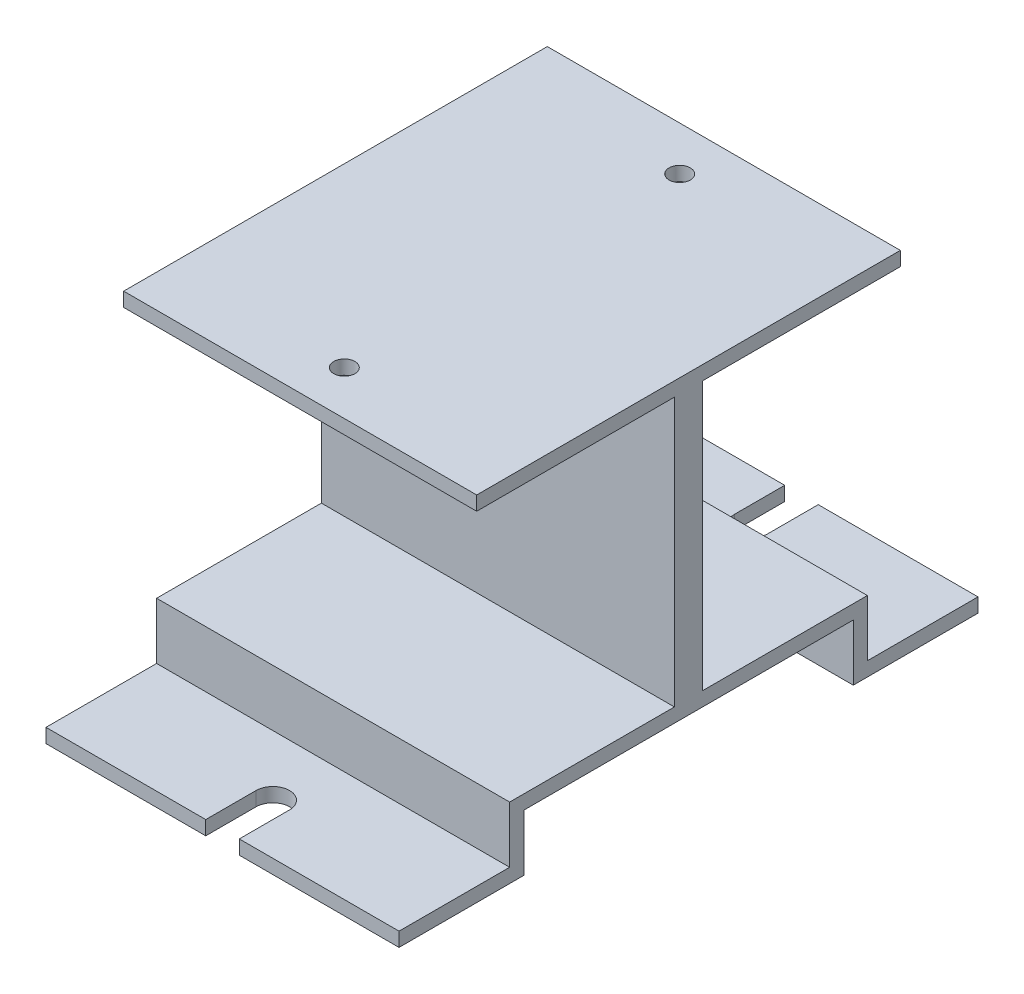
ISO-10303-21;
HEADER;
FILE_DESCRIPTION(('STEP AP214'),'2;1');
FILE_NAME('part.step','',(''),(''),'','','');
FILE_SCHEMA(('AUTOMOTIVE_DESIGN { 1 0 10303 214 1 1 1 1 }'));
ENDSEC;
DATA;
#1=APPLICATION_CONTEXT('core data for automotive mechanical design processes');
#2=APPLICATION_PROTOCOL_DEFINITION('international standard','automotive_design',2000,#1);
#3=PRODUCT_CONTEXT('',#1,'mechanical');
#4=PRODUCT('Part','Part','',(#3));
#5=PRODUCT_RELATED_PRODUCT_CATEGORY('part','',(#4));
#6=PRODUCT_DEFINITION_FORMATION('','',#4);
#7=PRODUCT_DEFINITION_CONTEXT('part definition',#1,'design');
#8=PRODUCT_DEFINITION('design','',#6,#7);
#9=PRODUCT_DEFINITION_SHAPE('','',#8);
#10=(LENGTH_UNIT() NAMED_UNIT(*) SI_UNIT(.MILLI.,.METRE.));
#11=(NAMED_UNIT(*) PLANE_ANGLE_UNIT() SI_UNIT($,.RADIAN.));
#12=(NAMED_UNIT(*) SI_UNIT($,.STERADIAN.) SOLID_ANGLE_UNIT());
#13=UNCERTAINTY_MEASURE_WITH_UNIT(LENGTH_MEASURE(1.E-05),#10,'distance_accuracy_value','');
#14=(GEOMETRIC_REPRESENTATION_CONTEXT(3) GLOBAL_UNCERTAINTY_ASSIGNED_CONTEXT((#13)) GLOBAL_UNIT_ASSIGNED_CONTEXT((#10,
#11,#12)) REPRESENTATION_CONTEXT('',''));
#15=CARTESIAN_POINT('',(0.,0.,0.));
#16=DIRECTION('',(0.,0.,1.));
#17=DIRECTION('',(1.,0.,0.));
#18=AXIS2_PLACEMENT_3D('',#15,#16,#17);
#19=CARTESIAN_POINT('',(25.,-6.,-41.));
#20=DIRECTION('',(0.,0.,-1.));
#21=DIRECTION('',(-1.,0.,0.));
#22=AXIS2_PLACEMENT_3D('',#19,#20,#21);
#23=PLANE('',#22);
#24=DIRECTION('',(0.,1.,0.));
#25=VECTOR('',#24,1.);
#26=CARTESIAN_POINT('',(-2.375,-6.,-41.));
#27=LINE('',#26,#25);
#28=CARTESIAN_POINT('',(-2.375,-8.,-41.));
#29=VERTEX_POINT('',#28);
#30=CARTESIAN_POINT('',(-2.375,-6.,-41.));
#31=VERTEX_POINT('',#30);
#32=EDGE_CURVE('E230',#29,#31,#27,.T.);
#33=ORIENTED_EDGE('',*,*,#32,.F.);
#34=DIRECTION('',(-1.,0.,0.));
#35=VECTOR('',#34,1.);
#36=CARTESIAN_POINT('',(25.,-8.,-41.));
#37=LINE('',#36,#35);
#38=CARTESIAN_POINT('',(-25.,-8.,-41.));
#39=VERTEX_POINT('',#38);
#40=EDGE_CURVE('E430',#29,#39,#37,.T.);
#41=ORIENTED_EDGE('',*,*,#40,.T.);
#42=DIRECTION('',(0.,-1.,0.));
#43=VECTOR('',#42,1.);
#44=CARTESIAN_POINT('',(-25.,-6.,-41.));
#45=LINE('',#44,#43);
#46=CARTESIAN_POINT('',(-25.,-6.,-41.));
#47=VERTEX_POINT('',#46);
#48=EDGE_CURVE('E403',#47,#39,#45,.T.);
#49=ORIENTED_EDGE('',*,*,#48,.F.);
#50=DIRECTION('',(-1.,0.,0.));
#51=VECTOR('',#50,1.);
#52=CARTESIAN_POINT('',(25.,-6.,-41.));
#53=LINE('',#52,#51);
#54=EDGE_CURVE('E427',#31,#47,#53,.T.);
#55=ORIENTED_EDGE('',*,*,#54,.F.);
#56=EDGE_LOOP('',(#33,#41,#49,#55));
#57=FACE_BOUND('',#56,.T.);
#58=ADVANCED_FACE('F32',(#57),#23,.T.);
#59=CARTESIAN_POINT('',(25.,-6.,41.));
#60=DIRECTION('',(0.,0.,1.));
#61=DIRECTION('',(-1.,0.,0.));
#62=AXIS2_PLACEMENT_3D('',#59,#60,#61);
#63=PLANE('',#62);
#64=DIRECTION('',(0.,1.,0.));
#65=VECTOR('',#64,1.);
#66=CARTESIAN_POINT('',(2.375,-6.,41.));
#67=LINE('',#66,#65);
#68=CARTESIAN_POINT('',(2.375,-8.,41.));
#69=VERTEX_POINT('',#68);
#70=CARTESIAN_POINT('',(2.375,-6.,41.));
#71=VERTEX_POINT('',#70);
#72=EDGE_CURVE('E255',#69,#71,#67,.T.);
#73=ORIENTED_EDGE('',*,*,#72,.F.);
#74=DIRECTION('',(-1.,0.,0.));
#75=VECTOR('',#74,1.);
#76=CARTESIAN_POINT('',(25.,-8.,41.));
#77=LINE('',#76,#75);
#78=CARTESIAN_POINT('',(25.,-8.,41.));
#79=VERTEX_POINT('',#78);
#80=EDGE_CURVE('E347',#79,#69,#77,.T.);
#81=ORIENTED_EDGE('',*,*,#80,.F.);
#82=DIRECTION('',(0.,-1.,0.));
#83=VECTOR('',#82,1.);
#84=CARTESIAN_POINT('',(25.,-6.,41.));
#85=LINE('',#84,#83);
#86=CARTESIAN_POINT('',(25.,-6.,41.));
#87=VERTEX_POINT('',#86);
#88=EDGE_CURVE('E304',#87,#79,#85,.T.);
#89=ORIENTED_EDGE('',*,*,#88,.F.);
#90=DIRECTION('',(-1.,0.,0.));
#91=VECTOR('',#90,1.);
#92=CARTESIAN_POINT('',(25.,-6.,41.));
#93=LINE('',#92,#91);
#94=EDGE_CURVE('E343',#87,#71,#93,.T.);
#95=ORIENTED_EDGE('',*,*,#94,.T.);
#96=EDGE_LOOP('',(#73,#81,#89,#95));
#97=FACE_BOUND('',#96,.T.);
#98=ADVANCED_FACE('F470',(#97),#63,.T.);
#99=CARTESIAN_POINT('',(25.,2.,0.));
#100=DIRECTION('',(0.,1.,0.));
#101=DIRECTION('',(0.,0.,1.));
#102=AXIS2_PLACEMENT_3D('',#99,#100,#101);
#103=PLANE('',#102);
#104=DIRECTION('',(0.,0.,-1.));
#105=VECTOR('',#104,1.);
#106=CARTESIAN_POINT('',(-25.,2.,0.));
#107=LINE('',#106,#105);
#108=CARTESIAN_POINT('',(-25.,2.,-2.));
#109=VERTEX_POINT('',#108);
#110=CARTESIAN_POINT('',(-25.,2.,-25.3334923450066));
#111=VERTEX_POINT('',#110);
#112=EDGE_CURVE('E412',#109,#111,#107,.T.);
#113=ORIENTED_EDGE('',*,*,#112,.F.);
#114=DIRECTION('',(1.,0.,0.));
#115=VECTOR('',#114,1.);
#116=CARTESIAN_POINT('',(25.,2.,-2.));
#117=LINE('',#116,#115);
#118=CARTESIAN_POINT('',(25.,2.,-2.));
#119=VERTEX_POINT('',#118);
#120=EDGE_CURVE('E378',#109,#119,#117,.T.);
#121=ORIENTED_EDGE('',*,*,#120,.T.);
#122=DIRECTION('',(0.,0.,-1.));
#123=VECTOR('',#122,1.);
#124=CARTESIAN_POINT('',(25.,2.,0.));
#125=LINE('',#124,#123);
#126=CARTESIAN_POINT('',(25.,2.,-25.3334923450066));
#127=VERTEX_POINT('',#126);
#128=EDGE_CURVE('E394',#119,#127,#125,.T.);
#129=ORIENTED_EDGE('',*,*,#128,.T.);
#130=DIRECTION('',(-1.,0.,0.));
#131=VECTOR('',#130,1.);
#132=CARTESIAN_POINT('',(25.,2.,-25.3334923450066));
#133=LINE('',#132,#131);
#134=EDGE_CURVE('E422',#127,#111,#133,.T.);
#135=ORIENTED_EDGE('',*,*,#134,.T.);
#136=EDGE_LOOP('',(#113,#121,#129,#135));
#137=FACE_BOUND('',#136,.T.);
#138=ADVANCED_FACE('F476',(#137),#103,.T.);
#139=CARTESIAN_POINT('',(25.,-8.,-23.3334923450066));
#140=DIRECTION('',(0.,1.,0.));
#141=DIRECTION('',(0.,0.,1.));
#142=AXIS2_PLACEMENT_3D('',#139,#140,#141);
#143=PLANE('',#142);
#144=ORIENTED_EDGE('',*,*,#40,.F.);
#145=DIRECTION('',(0.,0.,1.));
#146=VECTOR('',#145,1.);
#147=CARTESIAN_POINT('',(-2.375,-8.,-23.3334923450066));
#148=LINE('',#147,#146);
#149=CARTESIAN_POINT('',(-2.375,-8.,-33.875));
#150=VERTEX_POINT('',#149);
#151=EDGE_CURVE('E269',#29,#150,#148,.T.);
#152=ORIENTED_EDGE('',*,*,#151,.T.);
#153=CARTESIAN_POINT('',(0.,-8.,-33.875));
#154=DIRECTION('',(0.,1.,0.));
#155=DIRECTION('',(0.,0.,1.));
#156=AXIS2_PLACEMENT_3D('',#153,#154,#155);
#157=CIRCLE('',#156,2.375);
#158=CARTESIAN_POINT('',(2.375,-8.,-33.875));
#159=VERTEX_POINT('',#158);
#160=EDGE_CURVE('E221',#150,#159,#157,.T.);
#161=ORIENTED_EDGE('',*,*,#160,.T.);
#162=DIRECTION('',(0.,0.,-1.));
#163=VECTOR('',#162,1.);
#164=CARTESIAN_POINT('',(2.375,-8.,-23.3334923450066));
#165=LINE('',#164,#163);
#166=CARTESIAN_POINT('',(2.375,-8.,-41.));
#167=VERTEX_POINT('',#166);
#168=EDGE_CURVE('E265',#159,#167,#165,.T.);
#169=ORIENTED_EDGE('',*,*,#168,.T.);
#170=CARTESIAN_POINT('',(25.,-8.,-41.));
#171=VERTEX_POINT('',#170);
#172=EDGE_CURVE('E431',#171,#167,#37,.T.);
#173=ORIENTED_EDGE('',*,*,#172,.F.);
#174=DIRECTION('',(0.,0.,-1.));
#175=VECTOR('',#174,1.);
#176=CARTESIAN_POINT('',(25.,-8.,-23.3334923450066));
#177=LINE('',#176,#175);
#178=CARTESIAN_POINT('',(25.,-8.,-23.3334923450066));
#179=VERTEX_POINT('',#178);
#180=EDGE_CURVE('E382',#179,#171,#177,.T.);
#181=ORIENTED_EDGE('',*,*,#180,.F.);
#182=DIRECTION('',(-1.,0.,0.));
#183=VECTOR('',#182,1.);
#184=CARTESIAN_POINT('',(25.,-8.,-23.3334923450066));
#185=LINE('',#184,#183);
#186=CARTESIAN_POINT('',(-25.,-8.,-23.3334923450066));
#187=VERTEX_POINT('',#186);
#188=EDGE_CURVE('E400',#179,#187,#185,.T.);
#189=ORIENTED_EDGE('',*,*,#188,.T.);
#190=DIRECTION('',(0.,0.,-1.));
#191=VECTOR('',#190,1.);
#192=CARTESIAN_POINT('',(-25.,-8.,-23.3334923450066));
#193=LINE('',#192,#191);
#194=EDGE_CURVE('E381',#187,#39,#193,.T.);
#195=ORIENTED_EDGE('',*,*,#194,.T.);
#196=EDGE_LOOP('',(#144,#152,#161,#169,#173,#181,#189,#195));
#197=FACE_BOUND('',#196,.T.);
#198=ADVANCED_FACE('F34',(#197),#143,.F.);
#199=DIRECTION('',(0.,-1.,0.));
#200=VECTOR('',#199,1.);
#201=CARTESIAN_POINT('',(2.375,-6.,-41.));
#202=LINE('',#201,#200);
#203=CARTESIAN_POINT('',(2.375,-6.,-41.));
#204=VERTEX_POINT('',#203);
#205=EDGE_CURVE('E263',#204,#167,#202,.T.);
#206=ORIENTED_EDGE('',*,*,#205,.F.);
#207=CARTESIAN_POINT('',(25.,-6.,-41.));
#208=VERTEX_POINT('',#207);
#209=EDGE_CURVE('E428',#208,#204,#53,.T.);
#210=ORIENTED_EDGE('',*,*,#209,.F.);
#211=DIRECTION('',(0.,-1.,0.));
#212=VECTOR('',#211,1.);
#213=CARTESIAN_POINT('',(25.,-6.,-41.));
#214=LINE('',#213,#212);
#215=EDGE_CURVE('E384',#208,#171,#214,.T.);
#216=ORIENTED_EDGE('',*,*,#215,.T.);
#217=ORIENTED_EDGE('',*,*,#172,.T.);
#218=EDGE_LOOP('',(#206,#210,#216,#217));
#219=FACE_BOUND('',#218,.T.);
#220=ADVANCED_FACE('F472',(#219),#23,.T.);
#221=CARTESIAN_POINT('',(25.,-6.,-23.3334923450066));
#222=DIRECTION('',(0.,1.,0.));
#223=DIRECTION('',(0.,0.,1.));
#224=AXIS2_PLACEMENT_3D('',#221,#222,#223);
#225=PLANE('',#224);
#226=DIRECTION('',(0.,0.,1.));
#227=VECTOR('',#226,1.);
#228=CARTESIAN_POINT('',(-2.375,-6.,-23.3334923450066));
#229=LINE('',#228,#227);
#230=CARTESIAN_POINT('',(-2.375,-6.,-33.875));
#231=VERTEX_POINT('',#230);
#232=EDGE_CURVE('E11',#31,#231,#229,.T.);
#233=ORIENTED_EDGE('',*,*,#232,.F.);
#234=ORIENTED_EDGE('',*,*,#54,.T.);
#235=DIRECTION('',(0.,0.,-1.));
#236=VECTOR('',#235,1.);
#237=CARTESIAN_POINT('',(-25.,-6.,-23.3334923450066));
#238=LINE('',#237,#236);
#239=CARTESIAN_POINT('',(-25.,-6.,-25.3334923450066));
#240=VERTEX_POINT('',#239);
#241=EDGE_CURVE('E406',#240,#47,#238,.T.);
#242=ORIENTED_EDGE('',*,*,#241,.F.);
#243=DIRECTION('',(-1.,0.,0.));
#244=VECTOR('',#243,1.);
#245=CARTESIAN_POINT('',(25.,-6.,-25.3334923450066));
#246=LINE('',#245,#244);
#247=CARTESIAN_POINT('',(25.,-6.,-25.3334923450066));
#248=VERTEX_POINT('',#247);
#249=EDGE_CURVE('E425',#248,#240,#246,.T.);
#250=ORIENTED_EDGE('',*,*,#249,.F.);
#251=DIRECTION('',(0.,0.,-1.));
#252=VECTOR('',#251,1.);
#253=CARTESIAN_POINT('',(25.,-6.,-23.3334923450066));
#254=LINE('',#253,#252);
#255=EDGE_CURVE('E388',#248,#208,#254,.T.);
#256=ORIENTED_EDGE('',*,*,#255,.T.);
#257=ORIENTED_EDGE('',*,*,#209,.T.);
#258=DIRECTION('',(0.,0.,-1.));
#259=VECTOR('',#258,1.);
#260=CARTESIAN_POINT('',(2.375,-6.,-33.875));
#261=LINE('',#260,#259);
#262=CARTESIAN_POINT('',(2.375,-6.,-33.875));
#263=VERTEX_POINT('',#262);
#264=EDGE_CURVE('E236',#263,#204,#261,.T.);
#265=ORIENTED_EDGE('',*,*,#264,.F.);
#266=CARTESIAN_POINT('',(0.,-6.,-33.875));
#267=DIRECTION('',(0.,1.,0.));
#268=DIRECTION('',(0.,0.,1.));
#269=AXIS2_PLACEMENT_3D('',#266,#267,#268);
#270=CIRCLE('',#269,2.375);
#271=EDGE_CURVE('E48',#231,#263,#270,.T.);
#272=ORIENTED_EDGE('',*,*,#271,.F.);
#273=EDGE_LOOP('',(#233,#234,#242,#250,#256,#257,#265,#272));
#274=FACE_BOUND('',#273,.T.);
#275=ADVANCED_FACE('F234',(#274),#225,.T.);
#276=CARTESIAN_POINT('',(25.,0.,-25.3334923450066));
#277=DIRECTION('',(0.,0.,-1.));
#278=DIRECTION('',(-1.,0.,0.));
#279=AXIS2_PLACEMENT_3D('',#276,#277,#278);
#280=PLANE('',#279);
#281=DIRECTION('',(0.,1.,0.));
#282=VECTOR('',#281,1.);
#283=CARTESIAN_POINT('',(-25.,0.,-25.3334923450066));
#284=LINE('',#283,#282);
#285=EDGE_CURVE('E409',#111,#240,#284,.F.);
#286=ORIENTED_EDGE('',*,*,#285,.F.);
#287=ORIENTED_EDGE('',*,*,#134,.F.);
#288=DIRECTION('',(0.,1.,0.));
#289=VECTOR('',#288,1.);
#290=CARTESIAN_POINT('',(25.,0.,-25.3334923450066));
#291=LINE('',#290,#289);
#292=EDGE_CURVE('E391',#127,#248,#291,.F.);
#293=ORIENTED_EDGE('',*,*,#292,.T.);
#294=ORIENTED_EDGE('',*,*,#249,.T.);
#295=EDGE_LOOP('',(#286,#287,#293,#294));
#296=FACE_BOUND('',#295,.T.);
#297=ADVANCED_FACE('F486',(#296),#280,.T.);
#298=CARTESIAN_POINT('',(25.,0.,0.));
#299=DIRECTION('',(0.,1.,0.));
#300=DIRECTION('',(0.,0.,1.));
#301=AXIS2_PLACEMENT_3D('',#298,#299,#300);
#302=PLANE('',#301);
#303=DIRECTION('',(0.,0.,-1.));
#304=VECTOR('',#303,1.);
#305=CARTESIAN_POINT('',(-25.,0.,0.));
#306=LINE('',#305,#304);
#307=CARTESIAN_POINT('',(-25.,0.,23.3334923450066));
#308=VERTEX_POINT('',#307);
#309=CARTESIAN_POINT('',(-25.,0.,-23.3334923450066));
#310=VERTEX_POINT('',#309);
#311=EDGE_CURVE('E414',#308,#310,#306,.T.);
#312=ORIENTED_EDGE('',*,*,#311,.T.);
#313=DIRECTION('',(-1.,0.,0.));
#314=VECTOR('',#313,1.);
#315=CARTESIAN_POINT('',(25.,0.,-23.3334923450066));
#316=LINE('',#315,#314);
#317=CARTESIAN_POINT('',(25.,0.,-23.3334923450066));
#318=VERTEX_POINT('',#317);
#319=EDGE_CURVE('E419',#318,#310,#316,.T.);
#320=ORIENTED_EDGE('',*,*,#319,.F.);
#321=DIRECTION('',(0.,0.,-1.));
#322=VECTOR('',#321,1.);
#323=CARTESIAN_POINT('',(25.,0.,0.));
#324=LINE('',#323,#322);
#325=CARTESIAN_POINT('',(25.,0.,23.3334923450066));
#326=VERTEX_POINT('',#325);
#327=EDGE_CURVE('E396',#326,#318,#324,.T.);
#328=ORIENTED_EDGE('',*,*,#327,.F.);
#329=DIRECTION('',(-1.,0.,0.));
#330=VECTOR('',#329,1.);
#331=CARTESIAN_POINT('',(25.,0.,23.3334923450066));
#332=LINE('',#331,#330);
#333=EDGE_CURVE('E333',#326,#308,#332,.T.);
#334=ORIENTED_EDGE('',*,*,#333,.T.);
#335=EDGE_LOOP('',(#312,#320,#328,#334));
#336=FACE_BOUND('',#335,.T.);
#337=ADVANCED_FACE('F546',(#336),#302,.F.);
#338=CARTESIAN_POINT('',(25.,0.,-23.3334923450066));
#339=DIRECTION('',(0.,0.,-1.));
#340=DIRECTION('',(-1.,0.,0.));
#341=AXIS2_PLACEMENT_3D('',#338,#339,#340);
#342=PLANE('',#341);
#343=DIRECTION('',(0.,-1.,0.));
#344=VECTOR('',#343,1.);
#345=CARTESIAN_POINT('',(-25.,0.,-23.3334923450066));
#346=LINE('',#345,#344);
#347=EDGE_CURVE('E385',#310,#187,#346,.T.);
#348=ORIENTED_EDGE('',*,*,#347,.T.);
#349=ORIENTED_EDGE('',*,*,#188,.F.);
#350=DIRECTION('',(0.,-1.,0.));
#351=VECTOR('',#350,1.);
#352=CARTESIAN_POINT('',(25.,0.,-23.3334923450066));
#353=LINE('',#352,#351);
#354=EDGE_CURVE('E398',#318,#179,#353,.T.);
#355=ORIENTED_EDGE('',*,*,#354,.F.);
#356=ORIENTED_EDGE('',*,*,#319,.T.);
#357=EDGE_LOOP('',(#348,#349,#355,#356));
#358=FACE_BOUND('',#357,.T.);
#359=ADVANCED_FACE('F552',(#358),#342,.F.);
#360=CARTESIAN_POINT('',(25.,0.,0.));
#361=DIRECTION('',(-1.,0.,0.));
#362=DIRECTION('',(0.,0.,1.));
#363=AXIS2_PLACEMENT_3D('',#360,#361,#362);
#364=PLANE('',#363);
#365=ORIENTED_EDGE('',*,*,#327,.T.);
#366=ORIENTED_EDGE('',*,*,#354,.T.);
#367=ORIENTED_EDGE('',*,*,#180,.T.);
#368=ORIENTED_EDGE('',*,*,#215,.F.);
#369=ORIENTED_EDGE('',*,*,#255,.F.);
#370=ORIENTED_EDGE('',*,*,#292,.F.);
#371=ORIENTED_EDGE('',*,*,#128,.F.);
#372=DIRECTION('',(0.,1.,0.));
#373=VECTOR('',#372,1.);
#374=CARTESIAN_POINT('',(25.,0.,-2.));
#375=LINE('',#374,#373);
#376=CARTESIAN_POINT('',(25.,40.,-2.));
#377=VERTEX_POINT('',#376);
#378=EDGE_CURVE('E360',#119,#377,#375,.T.);
#379=ORIENTED_EDGE('',*,*,#378,.T.);
#380=DIRECTION('',(0.,0.,-1.));
#381=VECTOR('',#380,1.);
#382=CARTESIAN_POINT('',(25.,40.,0.));
#383=LINE('',#382,#381);
#384=CARTESIAN_POINT('',(25.,40.,-30.));
#385=VERTEX_POINT('',#384);
#386=EDGE_CURVE('E351',#377,#385,#383,.T.);
#387=ORIENTED_EDGE('',*,*,#386,.T.);
#388=DIRECTION('',(0.,-1.,0.));
#389=VECTOR('',#388,1.);
#390=CARTESIAN_POINT('',(25.,42.,-30.));
#391=LINE('',#390,#389);
#392=CARTESIAN_POINT('',(25.,42.,-30.));
#393=VERTEX_POINT('',#392);
#394=EDGE_CURVE('E353',#393,#385,#391,.T.);
#395=ORIENTED_EDGE('',*,*,#394,.F.);
#396=DIRECTION('',(0.,0.,-1.));
#397=VECTOR('',#396,1.);
#398=CARTESIAN_POINT('',(25.,42.,0.));
#399=LINE('',#398,#397);
#400=CARTESIAN_POINT('',(25.,42.,30.));
#401=VERTEX_POINT('',#400);
#402=EDGE_CURVE('E357',#401,#393,#399,.T.);
#403=ORIENTED_EDGE('',*,*,#402,.F.);
#404=DIRECTION('',(0.,-1.,0.));
#405=VECTOR('',#404,1.);
#406=CARTESIAN_POINT('',(25.,42.,30.));
#407=LINE('',#406,#405);
#408=CARTESIAN_POINT('',(25.,40.,30.));
#409=VERTEX_POINT('',#408);
#410=EDGE_CURVE('E276',#401,#409,#407,.T.);
#411=ORIENTED_EDGE('',*,*,#410,.T.);
#412=DIRECTION('',(0.,0.,1.));
#413=VECTOR('',#412,1.);
#414=CARTESIAN_POINT('',(25.,40.,0.));
#415=LINE('',#414,#413);
#416=CARTESIAN_POINT('',(25.,40.,2.));
#417=VERTEX_POINT('',#416);
#418=EDGE_CURVE('E273',#417,#409,#415,.T.);
#419=ORIENTED_EDGE('',*,*,#418,.F.);
#420=DIRECTION('',(0.,1.,0.));
#421=VECTOR('',#420,1.);
#422=CARTESIAN_POINT('',(25.,0.,2.));
#423=LINE('',#422,#421);
#424=CARTESIAN_POINT('',(25.,2.,2.));
#425=VERTEX_POINT('',#424);
#426=EDGE_CURVE('E280',#425,#417,#423,.T.);
#427=ORIENTED_EDGE('',*,*,#426,.F.);
#428=DIRECTION('',(0.,0.,1.));
#429=VECTOR('',#428,1.);
#430=CARTESIAN_POINT('',(25.,2.,0.));
#431=LINE('',#430,#429);
#432=CARTESIAN_POINT('',(25.,2.,25.3334923450066));
#433=VERTEX_POINT('',#432);
#434=EDGE_CURVE('E311',#425,#433,#431,.T.);
#435=ORIENTED_EDGE('',*,*,#434,.T.);
#436=DIRECTION('',(0.,1.,0.));
#437=VECTOR('',#436,1.);
#438=CARTESIAN_POINT('',(25.,0.,25.3334923450066));
#439=LINE('',#438,#437);
#440=CARTESIAN_POINT('',(25.,-6.,25.3334923450066));
#441=VERTEX_POINT('',#440);
#442=EDGE_CURVE('E309',#433,#441,#439,.F.);
#443=ORIENTED_EDGE('',*,*,#442,.T.);
#444=DIRECTION('',(0.,0.,1.));
#445=VECTOR('',#444,1.);
#446=CARTESIAN_POINT('',(25.,-6.,23.3334923450066));
#447=LINE('',#446,#445);
#448=EDGE_CURVE('E307',#441,#87,#447,.T.);
#449=ORIENTED_EDGE('',*,*,#448,.T.);
#450=ORIENTED_EDGE('',*,*,#88,.T.);
#451=DIRECTION('',(0.,0.,1.));
#452=VECTOR('',#451,1.);
#453=CARTESIAN_POINT('',(25.,-8.,23.3334923450066));
#454=LINE('',#453,#452);
#455=CARTESIAN_POINT('',(25.,-8.,23.3334923450066));
#456=VERTEX_POINT('',#455);
#457=EDGE_CURVE('E301',#456,#79,#454,.T.);
#458=ORIENTED_EDGE('',*,*,#457,.F.);
#459=DIRECTION('',(0.,-1.,0.));
#460=VECTOR('',#459,1.);
#461=CARTESIAN_POINT('',(25.,0.,23.3334923450066));
#462=LINE('',#461,#460);
#463=EDGE_CURVE('E314',#326,#456,#462,.T.);
#464=ORIENTED_EDGE('',*,*,#463,.F.);
#465=EDGE_LOOP('',(#365,#366,#367,#368,#369,#370,#371,#379,#387,#395,#403,#411,#419,#427,#435,
#443,#449,#450,#458,#464));
#466=FACE_BOUND('',#465,.T.);
#467=ADVANCED_FACE('F496',(#466),#364,.F.);
#468=CARTESIAN_POINT('',(-25.,0.,0.));
#469=DIRECTION('',(-1.,0.,0.));
#470=DIRECTION('',(0.,0.,1.));
#471=AXIS2_PLACEMENT_3D('',#468,#469,#470);
#472=PLANE('',#471);
#473=ORIENTED_EDGE('',*,*,#311,.F.);
#474=DIRECTION('',(0.,-1.,0.));
#475=VECTOR('',#474,1.);
#476=CARTESIAN_POINT('',(-25.,0.,23.3334923450066));
#477=LINE('',#476,#475);
#478=CARTESIAN_POINT('',(-25.,-8.,23.3334923450066));
#479=VERTEX_POINT('',#478);
#480=EDGE_CURVE('E305',#308,#479,#477,.T.);
#481=ORIENTED_EDGE('',*,*,#480,.T.);
#482=DIRECTION('',(0.,0.,1.));
#483=VECTOR('',#482,1.);
#484=CARTESIAN_POINT('',(-25.,-8.,23.3334923450066));
#485=LINE('',#484,#483);
#486=CARTESIAN_POINT('',(-25.,-8.,41.));
#487=VERTEX_POINT('',#486);
#488=EDGE_CURVE('E300',#479,#487,#485,.T.);
#489=ORIENTED_EDGE('',*,*,#488,.T.);
#490=DIRECTION('',(0.,-1.,0.));
#491=VECTOR('',#490,1.);
#492=CARTESIAN_POINT('',(-25.,-6.,41.));
#493=LINE('',#492,#491);
#494=CARTESIAN_POINT('',(-25.,-6.,41.));
#495=VERTEX_POINT('',#494);
#496=EDGE_CURVE('E319',#495,#487,#493,.T.);
#497=ORIENTED_EDGE('',*,*,#496,.F.);
#498=DIRECTION('',(0.,0.,1.));
#499=VECTOR('',#498,1.);
#500=CARTESIAN_POINT('',(-25.,-6.,23.3334923450066));
#501=LINE('',#500,#499);
#502=CARTESIAN_POINT('',(-25.,-6.,25.3334923450066));
#503=VERTEX_POINT('',#502);
#504=EDGE_CURVE('E322',#503,#495,#501,.T.);
#505=ORIENTED_EDGE('',*,*,#504,.F.);
#506=DIRECTION('',(0.,1.,0.));
#507=VECTOR('',#506,1.);
#508=CARTESIAN_POINT('',(-25.,0.,25.3334923450066));
#509=LINE('',#508,#507);
#510=CARTESIAN_POINT('',(-25.,2.,25.3334923450066));
#511=VERTEX_POINT('',#510);
#512=EDGE_CURVE('E325',#511,#503,#509,.F.);
#513=ORIENTED_EDGE('',*,*,#512,.F.);
#514=DIRECTION('',(0.,0.,1.));
#515=VECTOR('',#514,1.);
#516=CARTESIAN_POINT('',(-25.,2.,0.));
#517=LINE('',#516,#515);
#518=CARTESIAN_POINT('',(-25.,2.,2.));
#519=VERTEX_POINT('',#518);
#520=EDGE_CURVE('E327',#519,#511,#517,.T.);
#521=ORIENTED_EDGE('',*,*,#520,.F.);
#522=DIRECTION('',(0.,1.,0.));
#523=VECTOR('',#522,1.);
#524=CARTESIAN_POINT('',(-25.,0.,2.));
#525=LINE('',#524,#523);
#526=CARTESIAN_POINT('',(-25.,40.,2.));
#527=VERTEX_POINT('',#526);
#528=EDGE_CURVE('E277',#519,#527,#525,.T.);
#529=ORIENTED_EDGE('',*,*,#528,.T.);
#530=DIRECTION('',(0.,0.,1.));
#531=VECTOR('',#530,1.);
#532=CARTESIAN_POINT('',(-25.,40.,0.));
#533=LINE('',#532,#531);
#534=CARTESIAN_POINT('',(-25.,40.,30.));
#535=VERTEX_POINT('',#534);
#536=EDGE_CURVE('E272',#527,#535,#533,.T.);
#537=ORIENTED_EDGE('',*,*,#536,.T.);
#538=DIRECTION('',(0.,-1.,0.));
#539=VECTOR('',#538,1.);
#540=CARTESIAN_POINT('',(-25.,42.,30.));
#541=LINE('',#540,#539);
#542=CARTESIAN_POINT('',(-25.,42.,30.));
#543=VERTEX_POINT('',#542);
#544=EDGE_CURVE('E286',#543,#535,#541,.T.);
#545=ORIENTED_EDGE('',*,*,#544,.F.);
#546=DIRECTION('',(0.,0.,-1.));
#547=VECTOR('',#546,1.);
#548=CARTESIAN_POINT('',(-25.,42.,0.));
#549=LINE('',#548,#547);
#550=CARTESIAN_POINT('',(-25.,42.,-30.));
#551=VERTEX_POINT('',#550);
#552=EDGE_CURVE('E368',#543,#551,#549,.T.);
#553=ORIENTED_EDGE('',*,*,#552,.T.);
#554=DIRECTION('',(0.,-1.,0.));
#555=VECTOR('',#554,1.);
#556=CARTESIAN_POINT('',(-25.,42.,-30.));
#557=LINE('',#556,#555);
#558=CARTESIAN_POINT('',(-25.,40.,-30.));
#559=VERTEX_POINT('',#558);
#560=EDGE_CURVE('E365',#551,#559,#557,.T.);
#561=ORIENTED_EDGE('',*,*,#560,.T.);
#562=DIRECTION('',(0.,0.,-1.));
#563=VECTOR('',#562,1.);
#564=CARTESIAN_POINT('',(-25.,40.,0.));
#565=LINE('',#564,#563);
#566=CARTESIAN_POINT('',(-25.,40.,-2.));
#567=VERTEX_POINT('',#566);
#568=EDGE_CURVE('E350',#567,#559,#565,.T.);
#569=ORIENTED_EDGE('',*,*,#568,.F.);
#570=DIRECTION('',(0.,1.,0.));
#571=VECTOR('',#570,1.);
#572=CARTESIAN_POINT('',(-25.,0.,-2.));
#573=LINE('',#572,#571);
#574=EDGE_CURVE('E354',#109,#567,#573,.T.);
#575=ORIENTED_EDGE('',*,*,#574,.F.);
#576=ORIENTED_EDGE('',*,*,#112,.T.);
#577=ORIENTED_EDGE('',*,*,#285,.T.);
#578=ORIENTED_EDGE('',*,*,#241,.T.);
#579=ORIENTED_EDGE('',*,*,#48,.T.);
#580=ORIENTED_EDGE('',*,*,#194,.F.);
#581=ORIENTED_EDGE('',*,*,#347,.F.);
#582=EDGE_LOOP('',(#473,#481,#489,#497,#505,#513,#521,#529,#537,#545,#553,#561,#569,#575,#576,
#577,#578,#579,#580,#581));
#583=FACE_BOUND('',#582,.T.);
#584=ADVANCED_FACE('F597',(#583),#472,.T.);
#585=CARTESIAN_POINT('',(25.,40.,0.));
#586=DIRECTION('',(0.,1.,0.));
#587=DIRECTION('',(0.,0.,1.));
#588=AXIS2_PLACEMENT_3D('',#585,#586,#587);
#589=PLANE('',#588);
#590=CARTESIAN_POINT('',(0.,40.,-23.75));
#591=DIRECTION('',(0.,1.,0.));
#592=DIRECTION('',(0.,0.,1.));
#593=AXIS2_PLACEMENT_3D('',#590,#591,#592);
#594=CIRCLE('',#593,1.5);
#595=CARTESIAN_POINT('',(0.,40.,-22.25));
#596=VERTEX_POINT('',#595);
#597=EDGE_CURVE('E243',#596,#596,#594,.T.);
#598=ORIENTED_EDGE('',*,*,#597,.T.);
#599=EDGE_LOOP('',(#598));
#600=FACE_BOUND('',#599,.T.);
#601=ORIENTED_EDGE('',*,*,#568,.T.);
#602=DIRECTION('',(-1.,0.,0.));
#603=VECTOR('',#602,1.);
#604=CARTESIAN_POINT('',(25.,40.,-30.));
#605=LINE('',#604,#603);
#606=EDGE_CURVE('E376',#385,#559,#605,.T.);
#607=ORIENTED_EDGE('',*,*,#606,.F.);
#608=ORIENTED_EDGE('',*,*,#386,.F.);
#609=DIRECTION('',(-1.,0.,0.));
#610=VECTOR('',#609,1.);
#611=CARTESIAN_POINT('',(25.,40.,-2.));
#612=LINE('',#611,#610);
#613=EDGE_CURVE('E362',#377,#567,#612,.T.);
#614=ORIENTED_EDGE('',*,*,#613,.T.);
#615=EDGE_LOOP('',(#601,#607,#608,#614));
#616=FACE_BOUND('',#615,.T.);
#617=ADVANCED_FACE('F512',(#600,#616),#589,.F.);
#618=CARTESIAN_POINT('',(25.,42.,-30.));
#619=DIRECTION('',(0.,0.,-1.));
#620=DIRECTION('',(-1.,0.,0.));
#621=AXIS2_PLACEMENT_3D('',#618,#619,#620);
#622=PLANE('',#621);
#623=ORIENTED_EDGE('',*,*,#560,.F.);
#624=DIRECTION('',(-1.,0.,0.));
#625=VECTOR('',#624,1.);
#626=CARTESIAN_POINT('',(25.,42.,-30.));
#627=LINE('',#626,#625);
#628=EDGE_CURVE('E374',#393,#551,#627,.T.);
#629=ORIENTED_EDGE('',*,*,#628,.F.);
#630=ORIENTED_EDGE('',*,*,#394,.T.);
#631=ORIENTED_EDGE('',*,*,#606,.T.);
#632=EDGE_LOOP('',(#623,#629,#630,#631));
#633=FACE_BOUND('',#632,.T.);
#634=ADVANCED_FACE('F515',(#633),#622,.T.);
#635=CARTESIAN_POINT('',(25.,42.,0.));
#636=DIRECTION('',(0.,1.,0.));
#637=DIRECTION('',(0.,0.,1.));
#638=AXIS2_PLACEMENT_3D('',#635,#636,#637);
#639=PLANE('',#638);
#640=CARTESIAN_POINT('',(0.,42.,-23.75));
#641=DIRECTION('',(0.,1.,0.));
#642=DIRECTION('',(0.,0.,1.));
#643=AXIS2_PLACEMENT_3D('',#640,#641,#642);
#644=CIRCLE('',#643,1.5);
#645=CARTESIAN_POINT('',(0.,42.,-22.25));
#646=VERTEX_POINT('',#645);
#647=EDGE_CURVE('E649',#646,#646,#644,.T.);
#648=ORIENTED_EDGE('',*,*,#647,.F.);
#649=EDGE_LOOP('',(#648));
#650=FACE_BOUND('',#649,.T.);
#651=CARTESIAN_POINT('',(0.,42.,23.75));
#652=DIRECTION('',(0.,1.,0.));
#653=DIRECTION('',(0.,0.,-1.));
#654=AXIS2_PLACEMENT_3D('',#651,#652,#653);
#655=CIRCLE('',#654,1.5);
#656=CARTESIAN_POINT('',(0.,42.,22.25));
#657=VERTEX_POINT('',#656);
#658=EDGE_CURVE('E654',#657,#657,#655,.T.);
#659=ORIENTED_EDGE('',*,*,#658,.F.);
#660=EDGE_LOOP('',(#659));
#661=FACE_BOUND('',#660,.T.);
#662=ORIENTED_EDGE('',*,*,#552,.F.);
#663=DIRECTION('',(-1.,0.,0.));
#664=VECTOR('',#663,1.);
#665=CARTESIAN_POINT('',(25.,42.,30.));
#666=LINE('',#665,#664);
#667=EDGE_CURVE('E292',#401,#543,#666,.T.);
#668=ORIENTED_EDGE('',*,*,#667,.F.);
#669=ORIENTED_EDGE('',*,*,#402,.T.);
#670=ORIENTED_EDGE('',*,*,#628,.T.);
#671=EDGE_LOOP('',(#662,#668,#669,#670));
#672=FACE_BOUND('',#671,.T.);
#673=ADVANCED_FACE('F518',(#650,#661,#672),#639,.T.);
#674=CARTESIAN_POINT('',(25.,0.,-2.));
#675=DIRECTION('',(0.,0.,1.));
#676=DIRECTION('',(1.,0.,0.));
#677=AXIS2_PLACEMENT_3D('',#674,#675,#676);
#678=PLANE('',#677);
#679=ORIENTED_EDGE('',*,*,#120,.F.);
#680=ORIENTED_EDGE('',*,*,#574,.T.);
#681=ORIENTED_EDGE('',*,*,#613,.F.);
#682=ORIENTED_EDGE('',*,*,#378,.F.);
#683=EDGE_LOOP('',(#679,#680,#681,#682));
#684=FACE_BOUND('',#683,.T.);
#685=ADVANCED_FACE('F509',(#684),#678,.F.);
#686=CARTESIAN_POINT('',(25.,2.,0.));
#687=DIRECTION('',(0.,1.,0.));
#688=DIRECTION('',(0.,0.,-1.));
#689=AXIS2_PLACEMENT_3D('',#686,#687,#688);
#690=PLANE('',#689);
#691=ORIENTED_EDGE('',*,*,#520,.T.);
#692=DIRECTION('',(-1.,0.,0.));
#693=VECTOR('',#692,1.);
#694=CARTESIAN_POINT('',(25.,2.,25.3334923450066));
#695=LINE('',#694,#693);
#696=EDGE_CURVE('E336',#433,#511,#695,.T.);
#697=ORIENTED_EDGE('',*,*,#696,.F.);
#698=ORIENTED_EDGE('',*,*,#434,.F.);
#699=DIRECTION('',(1.,0.,0.));
#700=VECTOR('',#699,1.);
#701=CARTESIAN_POINT('',(25.,2.,2.));
#702=LINE('',#701,#700);
#703=EDGE_CURVE('E297',#519,#425,#702,.T.);
#704=ORIENTED_EDGE('',*,*,#703,.F.);
#705=EDGE_LOOP('',(#691,#697,#698,#704));
#706=FACE_BOUND('',#705,.T.);
#707=ADVANCED_FACE('F531',(#706),#690,.T.);
#708=CARTESIAN_POINT('',(25.,-8.,23.3334923450066));
#709=DIRECTION('',(0.,1.,0.));
#710=DIRECTION('',(0.,0.,-1.));
#711=AXIS2_PLACEMENT_3D('',#708,#709,#710);
#712=PLANE('',#711);
#713=ORIENTED_EDGE('',*,*,#80,.T.);
#714=DIRECTION('',(0.,0.,-1.));
#715=VECTOR('',#714,1.);
#716=CARTESIAN_POINT('',(2.375,-8.,23.3334923450066));
#717=LINE('',#716,#715);
#718=CARTESIAN_POINT('',(2.375,-8.,33.875));
#719=VERTEX_POINT('',#718);
#720=EDGE_CURVE('E257',#69,#719,#717,.T.);
#721=ORIENTED_EDGE('',*,*,#720,.T.);
#722=CARTESIAN_POINT('',(0.,-8.,33.875));
#723=DIRECTION('',(0.,1.,0.));
#724=DIRECTION('',(0.,0.,1.));
#725=AXIS2_PLACEMENT_3D('',#722,#723,#724);
#726=CIRCLE('',#725,2.375);
#727=CARTESIAN_POINT('',(-2.375,-8.,33.875));
#728=VERTEX_POINT('',#727);
#729=EDGE_CURVE('E260',#719,#728,#726,.T.);
#730=ORIENTED_EDGE('',*,*,#729,.T.);
#731=DIRECTION('',(0.,0.,1.));
#732=VECTOR('',#731,1.);
#733=CARTESIAN_POINT('',(-2.375,-8.,23.3334923450066));
#734=LINE('',#733,#732);
#735=CARTESIAN_POINT('',(-2.375,-8.,41.));
#736=VERTEX_POINT('',#735);
#737=EDGE_CURVE('E252',#728,#736,#734,.T.);
#738=ORIENTED_EDGE('',*,*,#737,.T.);
#739=EDGE_CURVE('E346',#736,#487,#77,.T.);
#740=ORIENTED_EDGE('',*,*,#739,.T.);
#741=ORIENTED_EDGE('',*,*,#488,.F.);
#742=DIRECTION('',(-1.,0.,0.));
#743=VECTOR('',#742,1.);
#744=CARTESIAN_POINT('',(25.,-8.,23.3334923450066));
#745=LINE('',#744,#743);
#746=EDGE_CURVE('E316',#456,#479,#745,.T.);
#747=ORIENTED_EDGE('',*,*,#746,.F.);
#748=ORIENTED_EDGE('',*,*,#457,.T.);
#749=EDGE_LOOP('',(#713,#721,#730,#738,#740,#741,#747,#748));
#750=FACE_BOUND('',#749,.T.);
#751=ADVANCED_FACE('F454',(#750),#712,.F.);
#752=DIRECTION('',(0.,-1.,0.));
#753=VECTOR('',#752,1.);
#754=CARTESIAN_POINT('',(-2.375,-6.,41.));
#755=LINE('',#754,#753);
#756=CARTESIAN_POINT('',(-2.375,-6.,41.));
#757=VERTEX_POINT('',#756);
#758=EDGE_CURVE('E224',#757,#736,#755,.T.);
#759=ORIENTED_EDGE('',*,*,#758,.F.);
#760=EDGE_CURVE('E342',#757,#495,#93,.T.);
#761=ORIENTED_EDGE('',*,*,#760,.T.);
#762=ORIENTED_EDGE('',*,*,#496,.T.);
#763=ORIENTED_EDGE('',*,*,#739,.F.);
#764=EDGE_LOOP('',(#759,#761,#762,#763));
#765=FACE_BOUND('',#764,.T.);
#766=ADVANCED_FACE('F450',(#765),#63,.T.);
#767=CARTESIAN_POINT('',(25.,-6.,23.3334923450066));
#768=DIRECTION('',(0.,1.,0.));
#769=DIRECTION('',(0.,0.,-1.));
#770=AXIS2_PLACEMENT_3D('',#767,#768,#769);
#771=PLANE('',#770);
#772=DIRECTION('',(0.,0.,-1.));
#773=VECTOR('',#772,1.);
#774=CARTESIAN_POINT('',(2.375,-6.,23.3334923450066));
#775=LINE('',#774,#773);
#776=CARTESIAN_POINT('',(2.375,-6.,33.875));
#777=VERTEX_POINT('',#776);
#778=EDGE_CURVE('E41',#71,#777,#775,.T.);
#779=ORIENTED_EDGE('',*,*,#778,.F.);
#780=ORIENTED_EDGE('',*,*,#94,.F.);
#781=ORIENTED_EDGE('',*,*,#448,.F.);
#782=DIRECTION('',(-1.,0.,0.));
#783=VECTOR('',#782,1.);
#784=CARTESIAN_POINT('',(25.,-6.,25.3334923450066));
#785=LINE('',#784,#783);
#786=EDGE_CURVE('E339',#441,#503,#785,.T.);
#787=ORIENTED_EDGE('',*,*,#786,.T.);
#788=ORIENTED_EDGE('',*,*,#504,.T.);
#789=ORIENTED_EDGE('',*,*,#760,.F.);
#790=DIRECTION('',(0.,0.,1.));
#791=VECTOR('',#790,1.);
#792=CARTESIAN_POINT('',(-2.375,-6.,33.875));
#793=LINE('',#792,#791);
#794=CARTESIAN_POINT('',(-2.375,-6.,33.875));
#795=VERTEX_POINT('',#794);
#796=EDGE_CURVE('E248',#795,#757,#793,.T.);
#797=ORIENTED_EDGE('',*,*,#796,.F.);
#798=CARTESIAN_POINT('',(0.,-6.,33.875));
#799=DIRECTION('',(0.,1.,0.));
#800=DIRECTION('',(0.,0.,-1.));
#801=AXIS2_PLACEMENT_3D('',#798,#799,#800);
#802=CIRCLE('',#801,2.375);
#803=EDGE_CURVE('E56',#777,#795,#802,.T.);
#804=ORIENTED_EDGE('',*,*,#803,.F.);
#805=EDGE_LOOP('',(#779,#780,#781,#787,#788,#789,#797,#804));
#806=FACE_BOUND('',#805,.T.);
#807=ADVANCED_FACE('F443',(#806),#771,.T.);
#808=CARTESIAN_POINT('',(25.,0.,25.3334923450066));
#809=DIRECTION('',(0.,0.,1.));
#810=DIRECTION('',(-1.,0.,0.));
#811=AXIS2_PLACEMENT_3D('',#808,#809,#810);
#812=PLANE('',#811);
#813=ORIENTED_EDGE('',*,*,#512,.T.);
#814=ORIENTED_EDGE('',*,*,#786,.F.);
#815=ORIENTED_EDGE('',*,*,#442,.F.);
#816=ORIENTED_EDGE('',*,*,#696,.T.);
#817=EDGE_LOOP('',(#813,#814,#815,#816));
#818=FACE_BOUND('',#817,.T.);
#819=ADVANCED_FACE('F535',(#818),#812,.T.);
#820=CARTESIAN_POINT('',(25.,0.,23.3334923450066));
#821=DIRECTION('',(0.,0.,1.));
#822=DIRECTION('',(-1.,0.,0.));
#823=AXIS2_PLACEMENT_3D('',#820,#821,#822);
#824=PLANE('',#823);
#825=ORIENTED_EDGE('',*,*,#480,.F.);
#826=ORIENTED_EDGE('',*,*,#333,.F.);
#827=ORIENTED_EDGE('',*,*,#463,.T.);
#828=ORIENTED_EDGE('',*,*,#746,.T.);
#829=EDGE_LOOP('',(#825,#826,#827,#828));
#830=FACE_BOUND('',#829,.T.);
#831=ADVANCED_FACE('F544',(#830),#824,.F.);
#832=CARTESIAN_POINT('',(25.,40.,0.));
#833=DIRECTION('',(0.,1.,0.));
#834=DIRECTION('',(0.,0.,-1.));
#835=AXIS2_PLACEMENT_3D('',#832,#833,#834);
#836=PLANE('',#835);
#837=CARTESIAN_POINT('',(0.,40.,23.75));
#838=DIRECTION('',(0.,1.,0.));
#839=DIRECTION('',(0.,0.,1.));
#840=AXIS2_PLACEMENT_3D('',#837,#838,#839);
#841=CIRCLE('',#840,1.5);
#842=CARTESIAN_POINT('',(0.,40.,25.25));
#843=VERTEX_POINT('',#842);
#844=EDGE_CURVE('E36',#843,#843,#841,.T.);
#845=ORIENTED_EDGE('',*,*,#844,.T.);
#846=EDGE_LOOP('',(#845));
#847=FACE_BOUND('',#846,.T.);
#848=ORIENTED_EDGE('',*,*,#536,.F.);
#849=DIRECTION('',(-1.,0.,0.));
#850=VECTOR('',#849,1.);
#851=CARTESIAN_POINT('',(25.,40.,2.));
#852=LINE('',#851,#850);
#853=EDGE_CURVE('E283',#417,#527,#852,.T.);
#854=ORIENTED_EDGE('',*,*,#853,.F.);
#855=ORIENTED_EDGE('',*,*,#418,.T.);
#856=DIRECTION('',(-1.,0.,0.));
#857=VECTOR('',#856,1.);
#858=CARTESIAN_POINT('',(25.,40.,30.));
#859=LINE('',#858,#857);
#860=EDGE_CURVE('E295',#409,#535,#859,.T.);
#861=ORIENTED_EDGE('',*,*,#860,.T.);
#862=EDGE_LOOP('',(#848,#854,#855,#861));
#863=FACE_BOUND('',#862,.T.);
#864=ADVANCED_FACE('F525',(#847,#863),#836,.F.);
#865=CARTESIAN_POINT('',(25.,42.,30.));
#866=DIRECTION('',(0.,0.,1.));
#867=DIRECTION('',(-1.,0.,0.));
#868=AXIS2_PLACEMENT_3D('',#865,#866,#867);
#869=PLANE('',#868);
#870=ORIENTED_EDGE('',*,*,#544,.T.);
#871=ORIENTED_EDGE('',*,*,#860,.F.);
#872=ORIENTED_EDGE('',*,*,#410,.F.);
#873=ORIENTED_EDGE('',*,*,#667,.T.);
#874=EDGE_LOOP('',(#870,#871,#872,#873));
#875=FACE_BOUND('',#874,.T.);
#876=ADVANCED_FACE('F465',(#875),#869,.T.);
#877=CARTESIAN_POINT('',(25.,0.,2.));
#878=DIRECTION('',(0.,0.,-1.));
#879=DIRECTION('',(1.,0.,0.));
#880=AXIS2_PLACEMENT_3D('',#877,#878,#879);
#881=PLANE('',#880);
#882=ORIENTED_EDGE('',*,*,#703,.T.);
#883=ORIENTED_EDGE('',*,*,#426,.T.);
#884=ORIENTED_EDGE('',*,*,#853,.T.);
#885=ORIENTED_EDGE('',*,*,#528,.F.);
#886=EDGE_LOOP('',(#882,#883,#884,#885));
#887=FACE_BOUND('',#886,.T.);
#888=ADVANCED_FACE('F458',(#887),#881,.F.);
#889=CARTESIAN_POINT('',(0.,-16.,33.875));
#890=DIRECTION('',(0.,1.,0.));
#891=DIRECTION('',(0.,0.,1.));
#892=AXIS2_PLACEMENT_3D('',#889,#890,#891);
#893=CYLINDRICAL_SURFACE('',#892,2.375);
#894=DIRECTION('',(0.,1.,0.));
#895=VECTOR('',#894,1.);
#896=CARTESIAN_POINT('',(2.375,-16.,33.875));
#897=LINE('',#896,#895);
#898=EDGE_CURVE('E237',#719,#777,#897,.T.);
#899=ORIENTED_EDGE('',*,*,#898,.T.);
#900=ORIENTED_EDGE('',*,*,#803,.T.);
#901=DIRECTION('',(0.,1.,0.));
#902=VECTOR('',#901,1.);
#903=CARTESIAN_POINT('',(-2.375,-16.,33.875));
#904=LINE('',#903,#902);
#905=EDGE_CURVE('E240',#728,#795,#904,.T.);
#906=ORIENTED_EDGE('',*,*,#905,.F.);
#907=ORIENTED_EDGE('',*,*,#729,.F.);
#908=EDGE_LOOP('',(#899,#900,#906,#907));
#909=FACE_BOUND('',#908,.T.);
#910=ADVANCED_FACE('F456',(#909),#893,.F.);
#911=CARTESIAN_POINT('',(2.375,-16.,33.875));
#912=DIRECTION('',(1.,0.,0.));
#913=DIRECTION('',(0.,0.,-1.));
#914=AXIS2_PLACEMENT_3D('',#911,#912,#913);
#915=PLANE('',#914);
#916=ORIENTED_EDGE('',*,*,#72,.T.);
#917=ORIENTED_EDGE('',*,*,#778,.T.);
#918=ORIENTED_EDGE('',*,*,#898,.F.);
#919=ORIENTED_EDGE('',*,*,#720,.F.);
#920=EDGE_LOOP('',(#916,#917,#918,#919));
#921=FACE_BOUND('',#920,.T.);
#922=ADVANCED_FACE('F438',(#921),#915,.F.);
#923=CARTESIAN_POINT('',(-2.375,-16.,33.875));
#924=DIRECTION('',(-1.,0.,0.));
#925=DIRECTION('',(0.,0.,1.));
#926=AXIS2_PLACEMENT_3D('',#923,#924,#925);
#927=PLANE('',#926);
#928=ORIENTED_EDGE('',*,*,#905,.T.);
#929=ORIENTED_EDGE('',*,*,#796,.T.);
#930=ORIENTED_EDGE('',*,*,#758,.T.);
#931=ORIENTED_EDGE('',*,*,#737,.F.);
#932=EDGE_LOOP('',(#928,#929,#930,#931));
#933=FACE_BOUND('',#932,.T.);
#934=ADVANCED_FACE('F447',(#933),#927,.F.);
#935=CARTESIAN_POINT('',(0.,-16.,-33.875));
#936=DIRECTION('',(0.,1.,0.));
#937=DIRECTION('',(0.,0.,1.));
#938=AXIS2_PLACEMENT_3D('',#935,#936,#937);
#939=CYLINDRICAL_SURFACE('',#938,2.375);
#940=DIRECTION('',(0.,1.,0.));
#941=VECTOR('',#940,1.);
#942=CARTESIAN_POINT('',(-2.375,-16.,-33.875));
#943=LINE('',#942,#941);
#944=EDGE_CURVE('E218',#150,#231,#943,.T.);
#945=ORIENTED_EDGE('',*,*,#944,.T.);
#946=ORIENTED_EDGE('',*,*,#271,.T.);
#947=DIRECTION('',(0.,1.,0.));
#948=VECTOR('',#947,1.);
#949=CARTESIAN_POINT('',(2.375,-16.,-33.875));
#950=LINE('',#949,#948);
#951=EDGE_CURVE('E225',#159,#263,#950,.T.);
#952=ORIENTED_EDGE('',*,*,#951,.F.);
#953=ORIENTED_EDGE('',*,*,#160,.F.);
#954=EDGE_LOOP('',(#945,#946,#952,#953));
#955=FACE_BOUND('',#954,.T.);
#956=ADVANCED_FACE('F219',(#955),#939,.F.);
#957=CARTESIAN_POINT('',(-2.375,-16.,-33.875));
#958=DIRECTION('',(-1.,0.,0.));
#959=DIRECTION('',(0.,0.,1.));
#960=AXIS2_PLACEMENT_3D('',#957,#958,#959);
#961=PLANE('',#960);
#962=ORIENTED_EDGE('',*,*,#32,.T.);
#963=ORIENTED_EDGE('',*,*,#232,.T.);
#964=ORIENTED_EDGE('',*,*,#944,.F.);
#965=ORIENTED_EDGE('',*,*,#151,.F.);
#966=EDGE_LOOP('',(#962,#963,#964,#965));
#967=FACE_BOUND('',#966,.T.);
#968=ADVANCED_FACE('F228',(#967),#961,.F.);
#969=CARTESIAN_POINT('',(2.375,-16.,-33.875));
#970=DIRECTION('',(1.,0.,0.));
#971=DIRECTION('',(0.,0.,-1.));
#972=AXIS2_PLACEMENT_3D('',#969,#970,#971);
#973=PLANE('',#972);
#974=ORIENTED_EDGE('',*,*,#951,.T.);
#975=ORIENTED_EDGE('',*,*,#264,.T.);
#976=ORIENTED_EDGE('',*,*,#205,.T.);
#977=ORIENTED_EDGE('',*,*,#168,.F.);
#978=EDGE_LOOP('',(#974,#975,#976,#977));
#979=FACE_BOUND('',#978,.T.);
#980=ADVANCED_FACE('F556',(#979),#973,.F.);
#981=CARTESIAN_POINT('',(0.,39.,23.75));
#982=DIRECTION('',(0.,1.,0.));
#983=DIRECTION('',(0.,0.,1.));
#984=AXIS2_PLACEMENT_3D('',#981,#982,#983);
#985=CYLINDRICAL_SURFACE('',#984,1.5);
#986=ORIENTED_EDGE('',*,*,#658,.T.);
#987=EDGE_LOOP('',(#986));
#988=FACE_BOUND('',#987,.T.);
#989=ORIENTED_EDGE('',*,*,#844,.F.);
#990=EDGE_LOOP('',(#989));
#991=FACE_BOUND('',#990,.T.);
#992=ADVANCED_FACE('F558',(#988,#991),#985,.F.);
#993=CARTESIAN_POINT('',(0.,39.,-23.75));
#994=DIRECTION('',(0.,1.,0.));
#995=DIRECTION('',(0.,0.,1.));
#996=AXIS2_PLACEMENT_3D('',#993,#994,#995);
#997=CYLINDRICAL_SURFACE('',#996,1.5);
#998=ORIENTED_EDGE('',*,*,#647,.T.);
#999=EDGE_LOOP('',(#998));
#1000=FACE_BOUND('',#999,.T.);
#1001=ORIENTED_EDGE('',*,*,#597,.F.);
#1002=EDGE_LOOP('',(#1001));
#1003=FACE_BOUND('',#1002,.T.);
#1004=ADVANCED_FACE('F564',(#1000,#1003),#997,.F.);
#1005=CLOSED_SHELL('',(#58,#98,#138,#198,#220,#275,#297,#337,#359,#467,#584,#617,#634,#673,#685,
#707,#751,#766,#807,#819,#831,#864,#876,#888,#910,#922,#934,#956,#968,#980,#992,#1004));
#1006=MANIFOLD_SOLID_BREP('B2',#1005);
#1007=ADVANCED_BREP_SHAPE_REPRESENTATION('',(#18,#1006),#14);
#1008=SHAPE_DEFINITION_REPRESENTATION(#9,#1007);
ENDSEC;
END-ISO-10303-21;
